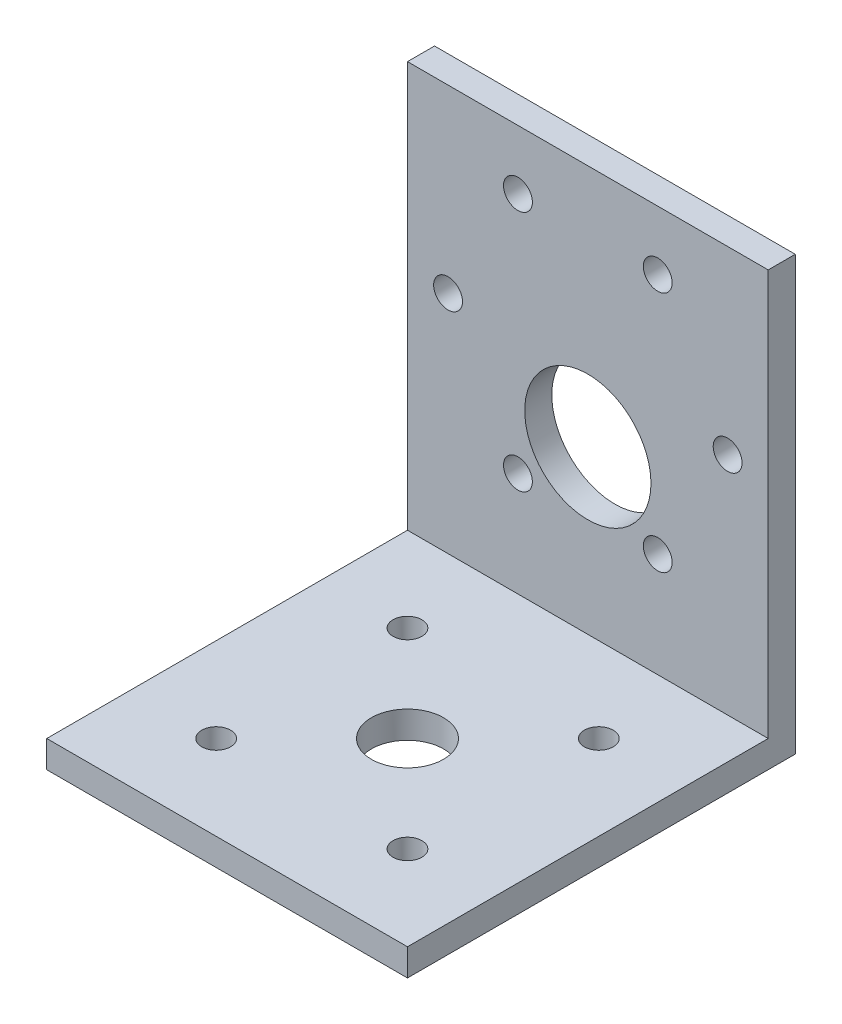
ISO-10303-21;
HEADER;
FILE_DESCRIPTION(('STEP AP214'),'2;1');
FILE_NAME('part.step','',(''),(''),'','','');
FILE_SCHEMA(('AUTOMOTIVE_DESIGN { 1 0 10303 214 1 1 1 1 }'));
ENDSEC;
DATA;
#1=APPLICATION_CONTEXT('core data for automotive mechanical design processes');
#2=APPLICATION_PROTOCOL_DEFINITION('international standard','automotive_design',2000,#1);
#3=PRODUCT_CONTEXT('',#1,'mechanical');
#4=PRODUCT('Part','Part','',(#3));
#5=PRODUCT_RELATED_PRODUCT_CATEGORY('part','',(#4));
#6=PRODUCT_DEFINITION_FORMATION('','',#4);
#7=PRODUCT_DEFINITION_CONTEXT('part definition',#1,'design');
#8=PRODUCT_DEFINITION('design','',#6,#7);
#9=PRODUCT_DEFINITION_SHAPE('','',#8);
#10=(LENGTH_UNIT() NAMED_UNIT(*) SI_UNIT(.MILLI.,.METRE.));
#11=(NAMED_UNIT(*) PLANE_ANGLE_UNIT() SI_UNIT($,.RADIAN.));
#12=(NAMED_UNIT(*) SI_UNIT($,.STERADIAN.) SOLID_ANGLE_UNIT());
#13=UNCERTAINTY_MEASURE_WITH_UNIT(LENGTH_MEASURE(1.E-05),#10,'distance_accuracy_value','');
#14=(GEOMETRIC_REPRESENTATION_CONTEXT(3) GLOBAL_UNCERTAINTY_ASSIGNED_CONTEXT((#13)) GLOBAL_UNIT_ASSIGNED_CONTEXT((#10,
#11,#12)) REPRESENTATION_CONTEXT('',''));
#15=CARTESIAN_POINT('',(0.,0.,0.));
#16=DIRECTION('',(0.,0.,1.));
#17=DIRECTION('',(1.,0.,0.));
#18=AXIS2_PLACEMENT_3D('',#15,#16,#17);
#19=CARTESIAN_POINT('',(0.,0.,3.));
#20=DIRECTION('',(0.,0.,1.));
#21=DIRECTION('',(1.,0.,0.));
#22=AXIS2_PLACEMENT_3D('',#19,#20,#21);
#23=PLANE('',#22);
#24=CARTESIAN_POINT('',(27.75,-33.4233937586588,3.));
#25=DIRECTION('',(0.,0.,1.));
#26=DIRECTION('',(1.,0.,0.));
#27=AXIS2_PLACEMENT_3D('',#24,#25,#26);
#28=CIRCLE('',#27,1.60000000000002);
#29=CARTESIAN_POINT('',(29.35,-33.4233937586588,3.));
#30=VERTEX_POINT('',#29);
#31=EDGE_CURVE('E288',#30,#30,#28,.T.);
#32=ORIENTED_EDGE('',*,*,#31,.F.);
#33=EDGE_LOOP('',(#32));
#34=FACE_BOUND('',#33,.T.);
#35=CARTESIAN_POINT('',(35.5,-20.,3.));
#36=DIRECTION('',(0.,0.,-1.));
#37=DIRECTION('',(-1.,0.,0.));
#38=AXIS2_PLACEMENT_3D('',#35,#36,#37);
#39=CIRCLE('',#38,1.6);
#40=CARTESIAN_POINT('',(33.9,-20.,3.));
#41=VERTEX_POINT('',#40);
#42=EDGE_CURVE('E296',#41,#41,#39,.T.);
#43=ORIENTED_EDGE('',*,*,#42,.T.);
#44=EDGE_LOOP('',(#43));
#45=FACE_BOUND('',#44,.T.);
#46=CARTESIAN_POINT('',(27.75,-6.57660624134121,3.));
#47=DIRECTION('',(0.,0.,-1.));
#48=DIRECTION('',(-1.,0.,0.));
#49=AXIS2_PLACEMENT_3D('',#46,#47,#48);
#50=CIRCLE('',#49,1.60000000000001);
#51=CARTESIAN_POINT('',(26.15,-6.57660624134121,3.));
#52=VERTEX_POINT('',#51);
#53=EDGE_CURVE('E304',#52,#52,#50,.T.);
#54=ORIENTED_EDGE('',*,*,#53,.T.);
#55=EDGE_LOOP('',(#54));
#56=FACE_BOUND('',#55,.T.);
#57=DIRECTION('',(0.,-1.,0.));
#58=VECTOR('',#57,1.);
#59=CARTESIAN_POINT('',(40.,0.,3.));
#60=LINE('',#59,#58);
#61=CARTESIAN_POINT('',(40.,0.,3.));
#62=VERTEX_POINT('',#61);
#63=CARTESIAN_POINT('',(40.,-45.,3.));
#64=VERTEX_POINT('',#63);
#65=EDGE_CURVE('E182',#62,#64,#60,.T.);
#66=ORIENTED_EDGE('',*,*,#65,.F.);
#67=DIRECTION('',(1.,0.,0.));
#68=VECTOR('',#67,1.);
#69=CARTESIAN_POINT('',(0.,0.,3.));
#70=LINE('',#69,#68);
#71=CARTESIAN_POINT('',(0.,0.,3.));
#72=VERTEX_POINT('',#71);
#73=EDGE_CURVE('E190',#72,#62,#70,.T.);
#74=ORIENTED_EDGE('',*,*,#73,.F.);
#75=DIRECTION('',(0.,-1.,0.));
#76=VECTOR('',#75,1.);
#77=CARTESIAN_POINT('',(0.,0.,3.));
#78=LINE('',#77,#76);
#79=CARTESIAN_POINT('',(0.,-45.,3.));
#80=VERTEX_POINT('',#79);
#81=EDGE_CURVE('E197',#72,#80,#78,.T.);
#82=ORIENTED_EDGE('',*,*,#81,.T.);
#83=DIRECTION('',(1.,0.,0.));
#84=VECTOR('',#83,1.);
#85=CARTESIAN_POINT('',(0.,-45.,3.));
#86=LINE('',#85,#84);
#87=EDGE_CURVE('E172',#80,#64,#86,.T.);
#88=ORIENTED_EDGE('',*,*,#87,.T.);
#89=EDGE_LOOP('',(#66,#74,#82,#88));
#90=FACE_BOUND('',#89,.T.);
#91=CARTESIAN_POINT('',(20.,-27.,3.));
#92=DIRECTION('',(0.,0.,1.));
#93=DIRECTION('',(1.,0.,0.));
#94=AXIS2_PLACEMENT_3D('',#91,#92,#93);
#95=CIRCLE('',#94,7.);
#96=CARTESIAN_POINT('',(27.,-27.,3.));
#97=VERTEX_POINT('',#96);
#98=EDGE_CURVE('E192',#97,#97,#95,.T.);
#99=ORIENTED_EDGE('',*,*,#98,.F.);
#100=EDGE_LOOP('',(#99));
#101=FACE_BOUND('',#100,.T.);
#102=CARTESIAN_POINT('',(12.25,-6.57660624134121,3.));
#103=DIRECTION('',(0.,0.,1.));
#104=DIRECTION('',(1.,0.,0.));
#105=AXIS2_PLACEMENT_3D('',#102,#103,#104);
#106=CIRCLE('',#105,1.6);
#107=CARTESIAN_POINT('',(13.85,-6.57660624134121,3.));
#108=VERTEX_POINT('',#107);
#109=EDGE_CURVE('E209',#108,#108,#106,.T.);
#110=ORIENTED_EDGE('',*,*,#109,.F.);
#111=EDGE_LOOP('',(#110));
#112=FACE_BOUND('',#111,.T.);
#113=CARTESIAN_POINT('',(12.25,-33.4233937586588,3.));
#114=DIRECTION('',(0.,0.,-1.));
#115=DIRECTION('',(-1.,0.,0.));
#116=AXIS2_PLACEMENT_3D('',#113,#114,#115);
#117=CIRCLE('',#116,1.60000000000001);
#118=CARTESIAN_POINT('',(10.65,-33.4233937586588,3.));
#119=VERTEX_POINT('',#118);
#120=EDGE_CURVE('E280',#119,#119,#117,.T.);
#121=ORIENTED_EDGE('',*,*,#120,.T.);
#122=EDGE_LOOP('',(#121));
#123=FACE_BOUND('',#122,.T.);
#124=CARTESIAN_POINT('',(4.5,-20.,3.));
#125=DIRECTION('',(0.,0.,1.));
#126=DIRECTION('',(1.,0.,0.));
#127=AXIS2_PLACEMENT_3D('',#124,#125,#126);
#128=CIRCLE('',#127,1.6);
#129=CARTESIAN_POINT('',(6.10000000000001,-20.,3.));
#130=VERTEX_POINT('',#129);
#131=EDGE_CURVE('E272',#130,#130,#128,.T.);
#132=ORIENTED_EDGE('',*,*,#131,.F.);
#133=EDGE_LOOP('',(#132));
#134=FACE_BOUND('',#133,.T.);
#135=ADVANCED_FACE('F137',(#34,#45,#56,#90,#101,#112,#123,#134),#23,.T.);
#136=CARTESIAN_POINT('',(0.,0.,0.));
#137=DIRECTION('',(0.,0.,1.));
#138=DIRECTION('',(1.,0.,0.));
#139=AXIS2_PLACEMENT_3D('',#136,#137,#138);
#140=PLANE('',#139);
#141=CARTESIAN_POINT('',(12.25,-33.4233937586588,0.));
#142=DIRECTION('',(0.,0.,-1.));
#143=DIRECTION('',(-1.,0.,0.));
#144=AXIS2_PLACEMENT_3D('',#141,#142,#143);
#145=CIRCLE('',#144,1.60000000000001);
#146=CARTESIAN_POINT('',(10.65,-33.4233937586588,0.));
#147=VERTEX_POINT('',#146);
#148=EDGE_CURVE('E276',#147,#147,#145,.T.);
#149=ORIENTED_EDGE('',*,*,#148,.F.);
#150=EDGE_LOOP('',(#149));
#151=FACE_BOUND('',#150,.T.);
#152=CARTESIAN_POINT('',(35.5,-20.,0.));
#153=DIRECTION('',(0.,0.,-1.));
#154=DIRECTION('',(-1.,0.,0.));
#155=AXIS2_PLACEMENT_3D('',#152,#153,#154);
#156=CIRCLE('',#155,1.6);
#157=CARTESIAN_POINT('',(33.9,-20.,0.));
#158=VERTEX_POINT('',#157);
#159=EDGE_CURVE('E292',#158,#158,#156,.T.);
#160=ORIENTED_EDGE('',*,*,#159,.F.);
#161=EDGE_LOOP('',(#160));
#162=FACE_BOUND('',#161,.T.);
#163=CARTESIAN_POINT('',(27.75,-6.57660624134121,0.));
#164=DIRECTION('',(0.,0.,-1.));
#165=DIRECTION('',(-1.,0.,0.));
#166=AXIS2_PLACEMENT_3D('',#163,#164,#165);
#167=CIRCLE('',#166,1.60000000000001);
#168=CARTESIAN_POINT('',(26.15,-6.57660624134121,0.));
#169=VERTEX_POINT('',#168);
#170=EDGE_CURVE('E300',#169,#169,#167,.T.);
#171=ORIENTED_EDGE('',*,*,#170,.F.);
#172=EDGE_LOOP('',(#171));
#173=FACE_BOUND('',#172,.T.);
#174=CARTESIAN_POINT('',(20.,-27.,0.));
#175=DIRECTION('',(0.,0.,1.));
#176=DIRECTION('',(1.,0.,0.));
#177=AXIS2_PLACEMENT_3D('',#174,#175,#176);
#178=CIRCLE('',#177,7.);
#179=CARTESIAN_POINT('',(27.,-27.,0.));
#180=VERTEX_POINT('',#179);
#181=EDGE_CURVE('E205',#180,#180,#178,.T.);
#182=ORIENTED_EDGE('',*,*,#181,.T.);
#183=EDGE_LOOP('',(#182));
#184=FACE_BOUND('',#183,.T.);
#185=DIRECTION('',(0.,-1.,0.));
#186=VECTOR('',#185,1.);
#187=CARTESIAN_POINT('',(40.,0.,0.));
#188=LINE('',#187,#186);
#189=CARTESIAN_POINT('',(40.,0.,0.));
#190=VERTEX_POINT('',#189);
#191=CARTESIAN_POINT('',(40.,-48.,0.));
#192=VERTEX_POINT('',#191);
#193=EDGE_CURVE('E184',#190,#192,#188,.T.);
#194=ORIENTED_EDGE('',*,*,#193,.T.);
#195=DIRECTION('',(-1.,0.,0.));
#196=VECTOR('',#195,1.);
#197=CARTESIAN_POINT('',(83.1045241245046,-48.,0.));
#198=LINE('',#197,#196);
#199=CARTESIAN_POINT('',(0.,-48.,0.));
#200=VERTEX_POINT('',#199);
#201=EDGE_CURVE('E229',#192,#200,#198,.T.);
#202=ORIENTED_EDGE('',*,*,#201,.T.);
#203=DIRECTION('',(0.,-1.,0.));
#204=VECTOR('',#203,1.);
#205=CARTESIAN_POINT('',(0.,0.,0.));
#206=LINE('',#205,#204);
#207=CARTESIAN_POINT('',(0.,0.,0.));
#208=VERTEX_POINT('',#207);
#209=EDGE_CURVE('E215',#208,#200,#206,.T.);
#210=ORIENTED_EDGE('',*,*,#209,.F.);
#211=DIRECTION('',(1.,0.,0.));
#212=VECTOR('',#211,1.);
#213=CARTESIAN_POINT('',(0.,0.,0.));
#214=LINE('',#213,#212);
#215=EDGE_CURVE('E212',#208,#190,#214,.T.);
#216=ORIENTED_EDGE('',*,*,#215,.T.);
#217=EDGE_LOOP('',(#194,#202,#210,#216));
#218=FACE_BOUND('',#217,.T.);
#219=CARTESIAN_POINT('',(12.25,-6.57660624134121,0.));
#220=DIRECTION('',(0.,0.,1.));
#221=DIRECTION('',(1.,0.,0.));
#222=AXIS2_PLACEMENT_3D('',#219,#220,#221);
#223=CIRCLE('',#222,1.6);
#224=CARTESIAN_POINT('',(13.85,-6.57660624134121,0.));
#225=VERTEX_POINT('',#224);
#226=EDGE_CURVE('E308',#225,#225,#223,.T.);
#227=ORIENTED_EDGE('',*,*,#226,.T.);
#228=EDGE_LOOP('',(#227));
#229=FACE_BOUND('',#228,.T.);
#230=CARTESIAN_POINT('',(27.75,-33.4233937586588,0.));
#231=DIRECTION('',(0.,0.,1.));
#232=DIRECTION('',(1.,0.,0.));
#233=AXIS2_PLACEMENT_3D('',#230,#231,#232);
#234=CIRCLE('',#233,1.60000000000002);
#235=CARTESIAN_POINT('',(29.35,-33.4233937586588,0.));
#236=VERTEX_POINT('',#235);
#237=EDGE_CURVE('E284',#236,#236,#234,.T.);
#238=ORIENTED_EDGE('',*,*,#237,.T.);
#239=EDGE_LOOP('',(#238));
#240=FACE_BOUND('',#239,.T.);
#241=CARTESIAN_POINT('',(4.5,-20.,0.));
#242=DIRECTION('',(0.,0.,1.));
#243=DIRECTION('',(1.,0.,0.));
#244=AXIS2_PLACEMENT_3D('',#241,#242,#243);
#245=CIRCLE('',#244,1.6);
#246=CARTESIAN_POINT('',(6.10000000000001,-20.,0.));
#247=VERTEX_POINT('',#246);
#248=EDGE_CURVE('E266',#247,#247,#245,.T.);
#249=ORIENTED_EDGE('',*,*,#248,.T.);
#250=EDGE_LOOP('',(#249));
#251=FACE_BOUND('',#250,.T.);
#252=ADVANCED_FACE('F226',(#151,#162,#173,#184,#218,#229,#240,#251),#140,.F.);
#253=CARTESIAN_POINT('',(40.,0.,3.));
#254=DIRECTION('',(1.,0.,0.));
#255=DIRECTION('',(0.,1.,0.));
#256=AXIS2_PLACEMENT_3D('',#253,#254,#255);
#257=PLANE('',#256);
#258=ORIENTED_EDGE('',*,*,#193,.F.);
#259=DIRECTION('',(0.,0.,-1.));
#260=VECTOR('',#259,1.);
#261=CARTESIAN_POINT('',(40.,0.,3.));
#262=LINE('',#261,#260);
#263=EDGE_CURVE('E12',#62,#190,#262,.T.);
#264=ORIENTED_EDGE('',*,*,#263,.F.);
#265=ORIENTED_EDGE('',*,*,#65,.T.);
#266=DIRECTION('',(0.,0.,1.));
#267=VECTOR('',#266,1.);
#268=CARTESIAN_POINT('',(40.,-45.,0.));
#269=LINE('',#268,#267);
#270=CARTESIAN_POINT('',(40.,-45.,43.));
#271=VERTEX_POINT('',#270);
#272=EDGE_CURVE('E155',#64,#271,#269,.T.);
#273=ORIENTED_EDGE('',*,*,#272,.T.);
#274=DIRECTION('',(0.,-1.,0.));
#275=VECTOR('',#274,1.);
#276=CARTESIAN_POINT('',(40.,-45.,43.));
#277=LINE('',#276,#275);
#278=CARTESIAN_POINT('',(40.,-48.,43.));
#279=VERTEX_POINT('',#278);
#280=EDGE_CURVE('E262',#271,#279,#277,.T.);
#281=ORIENTED_EDGE('',*,*,#280,.T.);
#282=DIRECTION('',(0.,0.,-1.));
#283=VECTOR('',#282,1.);
#284=CARTESIAN_POINT('',(40.,-48.,0.));
#285=LINE('',#284,#283);
#286=EDGE_CURVE('E247',#279,#192,#285,.T.);
#287=ORIENTED_EDGE('',*,*,#286,.T.);
#288=EDGE_LOOP('',(#258,#264,#265,#273,#281,#287));
#289=FACE_BOUND('',#288,.T.);
#290=ADVANCED_FACE('F181',(#289),#257,.T.);
#291=CARTESIAN_POINT('',(0.,0.,3.));
#292=DIRECTION('',(0.,1.,0.));
#293=DIRECTION('',(0.,0.,1.));
#294=AXIS2_PLACEMENT_3D('',#291,#292,#293);
#295=PLANE('',#294);
#296=ORIENTED_EDGE('',*,*,#215,.F.);
#297=DIRECTION('',(0.,0.,-1.));
#298=VECTOR('',#297,1.);
#299=CARTESIAN_POINT('',(0.,0.,3.));
#300=LINE('',#299,#298);
#301=EDGE_CURVE('E147',#72,#208,#300,.T.);
#302=ORIENTED_EDGE('',*,*,#301,.F.);
#303=ORIENTED_EDGE('',*,*,#73,.T.);
#304=ORIENTED_EDGE('',*,*,#263,.T.);
#305=EDGE_LOOP('',(#296,#302,#303,#304));
#306=FACE_BOUND('',#305,.T.);
#307=ADVANCED_FACE('F194',(#306),#295,.T.);
#308=CARTESIAN_POINT('',(0.,0.,3.));
#309=DIRECTION('',(1.,0.,0.));
#310=DIRECTION('',(0.,1.,0.));
#311=AXIS2_PLACEMENT_3D('',#308,#309,#310);
#312=PLANE('',#311);
#313=ORIENTED_EDGE('',*,*,#209,.T.);
#314=DIRECTION('',(0.,0.,-1.));
#315=VECTOR('',#314,1.);
#316=CARTESIAN_POINT('',(0.,-48.,0.));
#317=LINE('',#316,#315);
#318=CARTESIAN_POINT('',(0.,-48.,43.));
#319=VERTEX_POINT('',#318);
#320=EDGE_CURVE('E240',#319,#200,#317,.T.);
#321=ORIENTED_EDGE('',*,*,#320,.F.);
#322=DIRECTION('',(0.,-1.,0.));
#323=VECTOR('',#322,1.);
#324=CARTESIAN_POINT('',(0.,-45.,43.));
#325=LINE('',#324,#323);
#326=CARTESIAN_POINT('',(0.,-45.,43.));
#327=VERTEX_POINT('',#326);
#328=EDGE_CURVE('E252',#327,#319,#325,.T.);
#329=ORIENTED_EDGE('',*,*,#328,.F.);
#330=DIRECTION('',(0.,0.,1.));
#331=VECTOR('',#330,1.);
#332=CARTESIAN_POINT('',(0.,-45.,0.));
#333=LINE('',#332,#331);
#334=EDGE_CURVE('E236',#80,#327,#333,.T.);
#335=ORIENTED_EDGE('',*,*,#334,.F.);
#336=ORIENTED_EDGE('',*,*,#81,.F.);
#337=ORIENTED_EDGE('',*,*,#301,.T.);
#338=EDGE_LOOP('',(#313,#321,#329,#335,#336,#337));
#339=FACE_BOUND('',#338,.T.);
#340=ADVANCED_FACE('F221',(#339),#312,.F.);
#341=CARTESIAN_POINT('',(20.,-27.,3.));
#342=DIRECTION('',(0.,0.,-1.));
#343=DIRECTION('',(-1.,0.,0.));
#344=AXIS2_PLACEMENT_3D('',#341,#342,#343);
#345=CYLINDRICAL_SURFACE('',#344,7.);
#346=ORIENTED_EDGE('',*,*,#98,.T.);
#347=EDGE_LOOP('',(#346));
#348=FACE_BOUND('',#347,.T.);
#349=ORIENTED_EDGE('',*,*,#181,.F.);
#350=EDGE_LOOP('',(#349));
#351=FACE_BOUND('',#350,.T.);
#352=ADVANCED_FACE('F139',(#348,#351),#345,.F.);
#353=CARTESIAN_POINT('',(12.25,-6.57660624134121,3.));
#354=DIRECTION('',(0.,0.,-1.));
#355=DIRECTION('',(-1.,0.,0.));
#356=AXIS2_PLACEMENT_3D('',#353,#354,#355);
#357=CYLINDRICAL_SURFACE('',#356,1.6);
#358=ORIENTED_EDGE('',*,*,#109,.T.);
#359=EDGE_LOOP('',(#358));
#360=FACE_BOUND('',#359,.T.);
#361=ORIENTED_EDGE('',*,*,#226,.F.);
#362=EDGE_LOOP('',(#361));
#363=FACE_BOUND('',#362,.T.);
#364=ADVANCED_FACE('F364',(#360,#363),#357,.F.);
#365=CARTESIAN_POINT('',(27.75,-6.57660624134121,3.));
#366=DIRECTION('',(0.,0.,-1.));
#367=DIRECTION('',(-1.,0.,0.));
#368=AXIS2_PLACEMENT_3D('',#365,#366,#367);
#369=CYLINDRICAL_SURFACE('',#368,1.60000000000001);
#370=ORIENTED_EDGE('',*,*,#53,.F.);
#371=EDGE_LOOP('',(#370));
#372=FACE_BOUND('',#371,.T.);
#373=ORIENTED_EDGE('',*,*,#170,.T.);
#374=EDGE_LOOP('',(#373));
#375=FACE_BOUND('',#374,.T.);
#376=ADVANCED_FACE('F371',(#372,#375),#369,.F.);
#377=CARTESIAN_POINT('',(35.5,-20.,3.));
#378=DIRECTION('',(0.,0.,-1.));
#379=DIRECTION('',(-1.,0.,0.));
#380=AXIS2_PLACEMENT_3D('',#377,#378,#379);
#381=CYLINDRICAL_SURFACE('',#380,1.6);
#382=ORIENTED_EDGE('',*,*,#42,.F.);
#383=EDGE_LOOP('',(#382));
#384=FACE_BOUND('',#383,.T.);
#385=ORIENTED_EDGE('',*,*,#159,.T.);
#386=EDGE_LOOP('',(#385));
#387=FACE_BOUND('',#386,.T.);
#388=ADVANCED_FACE('F379',(#384,#387),#381,.F.);
#389=CARTESIAN_POINT('',(27.75,-33.4233937586588,3.));
#390=DIRECTION('',(0.,0.,-1.));
#391=DIRECTION('',(-1.,0.,0.));
#392=AXIS2_PLACEMENT_3D('',#389,#390,#391);
#393=CYLINDRICAL_SURFACE('',#392,1.60000000000002);
#394=ORIENTED_EDGE('',*,*,#31,.T.);
#395=EDGE_LOOP('',(#394));
#396=FACE_BOUND('',#395,.T.);
#397=ORIENTED_EDGE('',*,*,#237,.F.);
#398=EDGE_LOOP('',(#397));
#399=FACE_BOUND('',#398,.T.);
#400=ADVANCED_FACE('F388',(#396,#399),#393,.F.);
#401=CARTESIAN_POINT('',(12.25,-33.4233937586588,3.));
#402=DIRECTION('',(0.,0.,-1.));
#403=DIRECTION('',(-1.,0.,0.));
#404=AXIS2_PLACEMENT_3D('',#401,#402,#403);
#405=CYLINDRICAL_SURFACE('',#404,1.60000000000001);
#406=ORIENTED_EDGE('',*,*,#120,.F.);
#407=EDGE_LOOP('',(#406));
#408=FACE_BOUND('',#407,.T.);
#409=ORIENTED_EDGE('',*,*,#148,.T.);
#410=EDGE_LOOP('',(#409));
#411=FACE_BOUND('',#410,.T.);
#412=ADVANCED_FACE('F336',(#408,#411),#405,.F.);
#413=CARTESIAN_POINT('',(4.5,-20.,3.));
#414=DIRECTION('',(0.,0.,-1.));
#415=DIRECTION('',(-1.,0.,0.));
#416=AXIS2_PLACEMENT_3D('',#413,#414,#415);
#417=CYLINDRICAL_SURFACE('',#416,1.6);
#418=ORIENTED_EDGE('',*,*,#131,.T.);
#419=EDGE_LOOP('',(#418));
#420=FACE_BOUND('',#419,.T.);
#421=ORIENTED_EDGE('',*,*,#248,.F.);
#422=EDGE_LOOP('',(#421));
#423=FACE_BOUND('',#422,.T.);
#424=ADVANCED_FACE('F332',(#420,#423),#417,.F.);
#425=CARTESIAN_POINT('',(83.1045241245046,-45.,0.));
#426=DIRECTION('',(0.,-1.,0.));
#427=DIRECTION('',(0.,0.,-1.));
#428=AXIS2_PLACEMENT_3D('',#425,#426,#427);
#429=PLANE('',#428);
#430=CARTESIAN_POINT('',(30.6066017177982,-45.,33.6066017177982));
#431=DIRECTION('',(0.,-1.,0.));
#432=DIRECTION('',(0.,0.,-1.));
#433=AXIS2_PLACEMENT_3D('',#430,#431,#432);
#434=CIRCLE('',#433,1.6);
#435=CARTESIAN_POINT('',(30.6066017177982,-45.,32.0066017177982));
#436=VERTEX_POINT('',#435);
#437=EDGE_CURVE('E237',#436,#436,#434,.T.);
#438=ORIENTED_EDGE('',*,*,#437,.T.);
#439=EDGE_LOOP('',(#438));
#440=FACE_BOUND('',#439,.T.);
#441=CARTESIAN_POINT('',(30.6066017177982,-45.,12.3933982822018));
#442=DIRECTION('',(0.,-1.,0.));
#443=DIRECTION('',(0.,0.,-1.));
#444=AXIS2_PLACEMENT_3D('',#441,#442,#443);
#445=CIRCLE('',#444,1.60000000000001);
#446=CARTESIAN_POINT('',(30.6066017177982,-45.,10.7933982822018));
#447=VERTEX_POINT('',#446);
#448=EDGE_CURVE('E527',#447,#447,#445,.T.);
#449=ORIENTED_EDGE('',*,*,#448,.T.);
#450=EDGE_LOOP('',(#449));
#451=FACE_BOUND('',#450,.T.);
#452=CARTESIAN_POINT('',(9.39339828220178,-45.,12.3933982822018));
#453=DIRECTION('',(0.,-1.,0.));
#454=DIRECTION('',(0.,0.,-1.));
#455=AXIS2_PLACEMENT_3D('',#452,#453,#454);
#456=CIRCLE('',#455,1.6);
#457=CARTESIAN_POINT('',(9.39339828220178,-45.,10.7933982822018));
#458=VERTEX_POINT('',#457);
#459=EDGE_CURVE('E530',#458,#458,#456,.T.);
#460=ORIENTED_EDGE('',*,*,#459,.T.);
#461=EDGE_LOOP('',(#460));
#462=FACE_BOUND('',#461,.T.);
#463=CARTESIAN_POINT('',(9.3933982822018,-45.,33.6066017177982));
#464=DIRECTION('',(0.,-1.,0.));
#465=DIRECTION('',(0.,0.,-1.));
#466=AXIS2_PLACEMENT_3D('',#463,#464,#465);
#467=CIRCLE('',#466,1.6);
#468=CARTESIAN_POINT('',(9.3933982822018,-45.,32.0066017177982));
#469=VERTEX_POINT('',#468);
#470=EDGE_CURVE('E535',#469,#469,#467,.T.);
#471=ORIENTED_EDGE('',*,*,#470,.T.);
#472=EDGE_LOOP('',(#471));
#473=FACE_BOUND('',#472,.T.);
#474=CARTESIAN_POINT('',(20.,-45.,23.));
#475=DIRECTION('',(0.,-1.,0.));
#476=DIRECTION('',(0.,0.,-1.));
#477=AXIS2_PLACEMENT_3D('',#474,#475,#476);
#478=CIRCLE('',#477,4.);
#479=CARTESIAN_POINT('',(20.,-45.,19.));
#480=VERTEX_POINT('',#479);
#481=EDGE_CURVE('E541',#480,#480,#478,.T.);
#482=ORIENTED_EDGE('',*,*,#481,.T.);
#483=EDGE_LOOP('',(#482));
#484=FACE_BOUND('',#483,.T.);
#485=ORIENTED_EDGE('',*,*,#87,.F.);
#486=ORIENTED_EDGE('',*,*,#334,.T.);
#487=DIRECTION('',(-1.,0.,0.));
#488=VECTOR('',#487,1.);
#489=CARTESIAN_POINT('',(83.1045241245046,-45.,43.));
#490=LINE('',#489,#488);
#491=EDGE_CURVE('E259',#271,#327,#490,.T.);
#492=ORIENTED_EDGE('',*,*,#491,.F.);
#493=ORIENTED_EDGE('',*,*,#272,.F.);
#494=EDGE_LOOP('',(#485,#486,#492,#493));
#495=FACE_BOUND('',#494,.T.);
#496=ADVANCED_FACE('F335',(#440,#451,#462,#473,#484,#495),#429,.F.);
#497=CARTESIAN_POINT('',(83.1045241245046,-45.,43.));
#498=DIRECTION('',(0.,0.,-1.));
#499=DIRECTION('',(-1.,0.,0.));
#500=AXIS2_PLACEMENT_3D('',#497,#498,#499);
#501=PLANE('',#500);
#502=ORIENTED_EDGE('',*,*,#280,.F.);
#503=ORIENTED_EDGE('',*,*,#491,.T.);
#504=ORIENTED_EDGE('',*,*,#328,.T.);
#505=DIRECTION('',(-1.,0.,0.));
#506=VECTOR('',#505,1.);
#507=CARTESIAN_POINT('',(83.1045241245046,-48.,43.));
#508=LINE('',#507,#506);
#509=EDGE_CURVE('E243',#279,#319,#508,.T.);
#510=ORIENTED_EDGE('',*,*,#509,.F.);
#511=EDGE_LOOP('',(#502,#503,#504,#510));
#512=FACE_BOUND('',#511,.T.);
#513=ADVANCED_FACE('F449',(#512),#501,.F.);
#514=CARTESIAN_POINT('',(83.1045241245046,-48.,0.));
#515=DIRECTION('',(0.,1.,0.));
#516=DIRECTION('',(0.,0.,1.));
#517=AXIS2_PLACEMENT_3D('',#514,#515,#516);
#518=PLANE('',#517);
#519=CARTESIAN_POINT('',(30.6066017177982,-48.,33.6066017177982));
#520=DIRECTION('',(0.,1.,0.));
#521=DIRECTION('',(0.,0.,1.));
#522=AXIS2_PLACEMENT_3D('',#519,#520,#521);
#523=CIRCLE('',#522,1.6);
#524=CARTESIAN_POINT('',(30.6066017177982,-48.,35.2066017177982));
#525=VERTEX_POINT('',#524);
#526=EDGE_CURVE('E523',#525,#525,#523,.T.);
#527=ORIENTED_EDGE('',*,*,#526,.T.);
#528=EDGE_LOOP('',(#527));
#529=FACE_BOUND('',#528,.T.);
#530=CARTESIAN_POINT('',(30.6066017177982,-48.,12.3933982822018));
#531=DIRECTION('',(0.,1.,0.));
#532=DIRECTION('',(0.,0.,1.));
#533=AXIS2_PLACEMENT_3D('',#530,#531,#532);
#534=CIRCLE('',#533,1.60000000000001);
#535=CARTESIAN_POINT('',(30.6066017177982,-48.,13.9933982822018));
#536=VERTEX_POINT('',#535);
#537=EDGE_CURVE('E552',#536,#536,#534,.T.);
#538=ORIENTED_EDGE('',*,*,#537,.T.);
#539=EDGE_LOOP('',(#538));
#540=FACE_BOUND('',#539,.T.);
#541=CARTESIAN_POINT('',(9.39339828220178,-48.,12.3933982822018));
#542=DIRECTION('',(0.,1.,0.));
#543=DIRECTION('',(0.,0.,1.));
#544=AXIS2_PLACEMENT_3D('',#541,#542,#543);
#545=CIRCLE('',#544,1.6);
#546=CARTESIAN_POINT('',(9.39339828220178,-48.,13.9933982822018));
#547=VERTEX_POINT('',#546);
#548=EDGE_CURVE('E556',#547,#547,#545,.T.);
#549=ORIENTED_EDGE('',*,*,#548,.T.);
#550=EDGE_LOOP('',(#549));
#551=FACE_BOUND('',#550,.T.);
#552=CARTESIAN_POINT('',(9.3933982822018,-48.,33.6066017177982));
#553=DIRECTION('',(0.,1.,0.));
#554=DIRECTION('',(0.,0.,1.));
#555=AXIS2_PLACEMENT_3D('',#552,#553,#554);
#556=CIRCLE('',#555,1.6);
#557=CARTESIAN_POINT('',(9.3933982822018,-48.,35.2066017177982));
#558=VERTEX_POINT('',#557);
#559=EDGE_CURVE('E549',#558,#558,#556,.T.);
#560=ORIENTED_EDGE('',*,*,#559,.T.);
#561=EDGE_LOOP('',(#560));
#562=FACE_BOUND('',#561,.T.);
#563=CARTESIAN_POINT('',(20.,-48.,23.));
#564=DIRECTION('',(0.,1.,0.));
#565=DIRECTION('',(0.,0.,1.));
#566=AXIS2_PLACEMENT_3D('',#563,#564,#565);
#567=CIRCLE('',#566,4.);
#568=CARTESIAN_POINT('',(20.,-48.,27.));
#569=VERTEX_POINT('',#568);
#570=EDGE_CURVE('E545',#569,#569,#567,.T.);
#571=ORIENTED_EDGE('',*,*,#570,.T.);
#572=EDGE_LOOP('',(#571));
#573=FACE_BOUND('',#572,.T.);
#574=ORIENTED_EDGE('',*,*,#286,.F.);
#575=ORIENTED_EDGE('',*,*,#509,.T.);
#576=ORIENTED_EDGE('',*,*,#320,.T.);
#577=ORIENTED_EDGE('',*,*,#201,.F.);
#578=EDGE_LOOP('',(#574,#575,#576,#577));
#579=FACE_BOUND('',#578,.T.);
#580=ADVANCED_FACE('F241',(#529,#540,#551,#562,#573,#579),#518,.F.);
#581=CARTESIAN_POINT('',(20.,-48.,23.));
#582=DIRECTION('',(0.,1.,0.));
#583=DIRECTION('',(0.,0.,1.));
#584=AXIS2_PLACEMENT_3D('',#581,#582,#583);
#585=CYLINDRICAL_SURFACE('',#584,4.);
#586=ORIENTED_EDGE('',*,*,#570,.F.);
#587=EDGE_LOOP('',(#586));
#588=FACE_BOUND('',#587,.T.);
#589=ORIENTED_EDGE('',*,*,#481,.F.);
#590=EDGE_LOOP('',(#589));
#591=FACE_BOUND('',#590,.T.);
#592=ADVANCED_FACE('F467',(#588,#591),#585,.F.);
#593=CARTESIAN_POINT('',(9.3933982822018,-48.,33.6066017177982));
#594=DIRECTION('',(0.,1.,0.));
#595=DIRECTION('',(0.,0.,1.));
#596=AXIS2_PLACEMENT_3D('',#593,#594,#595);
#597=CYLINDRICAL_SURFACE('',#596,1.6);
#598=ORIENTED_EDGE('',*,*,#559,.F.);
#599=EDGE_LOOP('',(#598));
#600=FACE_BOUND('',#599,.T.);
#601=ORIENTED_EDGE('',*,*,#470,.F.);
#602=EDGE_LOOP('',(#601));
#603=FACE_BOUND('',#602,.T.);
#604=ADVANCED_FACE('F477',(#600,#603),#597,.F.);
#605=CARTESIAN_POINT('',(9.39339828220178,-48.,12.3933982822018));
#606=DIRECTION('',(0.,1.,0.));
#607=DIRECTION('',(0.,0.,1.));
#608=AXIS2_PLACEMENT_3D('',#605,#606,#607);
#609=CYLINDRICAL_SURFACE('',#608,1.6);
#610=ORIENTED_EDGE('',*,*,#548,.F.);
#611=EDGE_LOOP('',(#610));
#612=FACE_BOUND('',#611,.T.);
#613=ORIENTED_EDGE('',*,*,#459,.F.);
#614=EDGE_LOOP('',(#613));
#615=FACE_BOUND('',#614,.T.);
#616=ADVANCED_FACE('F487',(#612,#615),#609,.F.);
#617=CARTESIAN_POINT('',(30.6066017177982,-48.,12.3933982822018));
#618=DIRECTION('',(0.,1.,0.));
#619=DIRECTION('',(0.,0.,1.));
#620=AXIS2_PLACEMENT_3D('',#617,#618,#619);
#621=CYLINDRICAL_SURFACE('',#620,1.60000000000001);
#622=ORIENTED_EDGE('',*,*,#537,.F.);
#623=EDGE_LOOP('',(#622));
#624=FACE_BOUND('',#623,.T.);
#625=ORIENTED_EDGE('',*,*,#448,.F.);
#626=EDGE_LOOP('',(#625));
#627=FACE_BOUND('',#626,.T.);
#628=ADVANCED_FACE('F497',(#624,#627),#621,.F.);
#629=CARTESIAN_POINT('',(30.6066017177982,-48.,33.6066017177982));
#630=DIRECTION('',(0.,1.,0.));
#631=DIRECTION('',(0.,0.,1.));
#632=AXIS2_PLACEMENT_3D('',#629,#630,#631);
#633=CYLINDRICAL_SURFACE('',#632,1.6);
#634=ORIENTED_EDGE('',*,*,#526,.F.);
#635=EDGE_LOOP('',(#634));
#636=FACE_BOUND('',#635,.T.);
#637=ORIENTED_EDGE('',*,*,#437,.F.);
#638=EDGE_LOOP('',(#637));
#639=FACE_BOUND('',#638,.T.);
#640=ADVANCED_FACE('F507',(#636,#639),#633,.F.);
#641=CLOSED_SHELL('',(#135,#252,#290,#307,#340,#352,#364,#376,#388,#400,#412,#424,#496,#513,
#580,#592,#604,#616,#628,#640));
#642=MANIFOLD_SOLID_BREP('B2',#641);
#643=ADVANCED_BREP_SHAPE_REPRESENTATION('',(#18,#642),#14);
#644=SHAPE_DEFINITION_REPRESENTATION(#9,#643);
ENDSEC;
END-ISO-10303-21;
